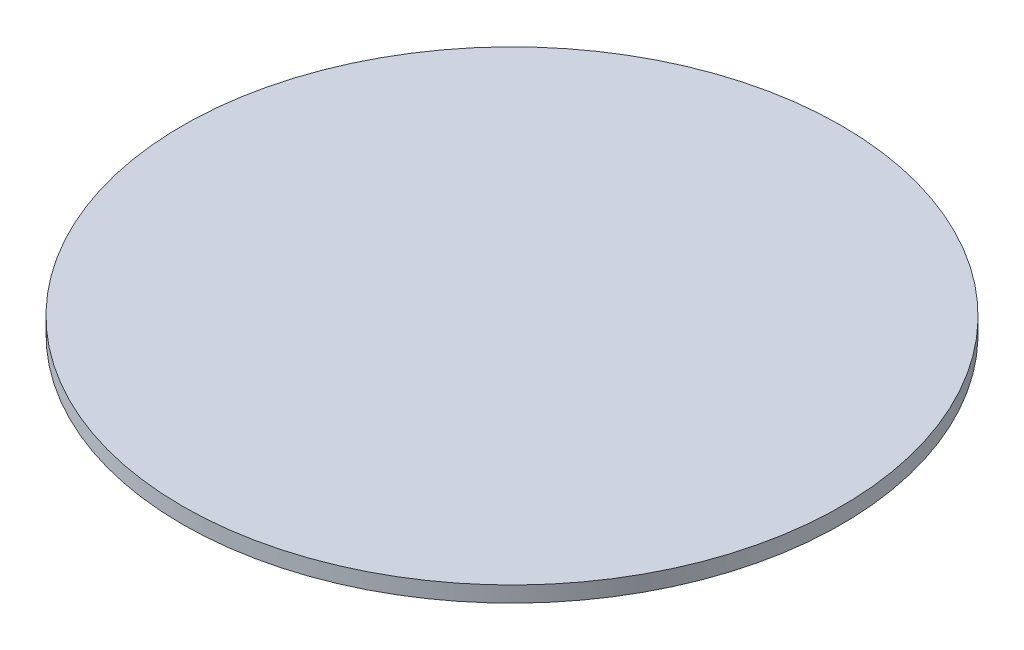
ISO-10303-21;
HEADER;
FILE_DESCRIPTION(('STEP AP214'),'2;1');
FILE_NAME('part.step','',(''),(''),'','','');
FILE_SCHEMA(('AUTOMOTIVE_DESIGN { 1 0 10303 214 1 1 1 1 }'));
ENDSEC;
DATA;
#1=APPLICATION_CONTEXT('core data for automotive mechanical design processes');
#2=APPLICATION_PROTOCOL_DEFINITION('international standard','automotive_design',2000,#1);
#3=PRODUCT_CONTEXT('',#1,'mechanical');
#4=PRODUCT('Part','Part','',(#3));
#5=PRODUCT_RELATED_PRODUCT_CATEGORY('part','',(#4));
#6=PRODUCT_DEFINITION_FORMATION('','',#4);
#7=PRODUCT_DEFINITION_CONTEXT('part definition',#1,'design');
#8=PRODUCT_DEFINITION('design','',#6,#7);
#9=PRODUCT_DEFINITION_SHAPE('','',#8);
#10=(LENGTH_UNIT() NAMED_UNIT(*) SI_UNIT(.MILLI.,.METRE.));
#11=(NAMED_UNIT(*) PLANE_ANGLE_UNIT() SI_UNIT($,.RADIAN.));
#12=(NAMED_UNIT(*) SI_UNIT($,.STERADIAN.) SOLID_ANGLE_UNIT());
#13=UNCERTAINTY_MEASURE_WITH_UNIT(LENGTH_MEASURE(1.E-05),#10,'distance_accuracy_value','');
#14=(GEOMETRIC_REPRESENTATION_CONTEXT(3) GLOBAL_UNCERTAINTY_ASSIGNED_CONTEXT((#13)) GLOBAL_UNIT_ASSIGNED_CONTEXT((#10,
#11,#12)) REPRESENTATION_CONTEXT('',''));
#15=CARTESIAN_POINT('',(0.,0.,0.));
#16=DIRECTION('',(0.,0.,1.));
#17=DIRECTION('',(1.,0.,0.));
#18=AXIS2_PLACEMENT_3D('',#15,#16,#17);
#19=CARTESIAN_POINT('',(-20.95,-0.500000000000001,0.));
#20=DIRECTION('',(0.,1.,0.));
#21=DIRECTION('',(0.,0.,1.));
#22=AXIS2_PLACEMENT_3D('',#19,#20,#21);
#23=PLANE('',#22);
#24=DIRECTION('',(-1.,0.,0.));
#25=VECTOR('',#24,1.);
#26=CARTESIAN_POINT('',(-2.,-0.500000000000001,15.5));
#27=LINE('',#26,#25);
#28=CARTESIAN_POINT('',(2.,-0.500000000000001,15.5));
#29=VERTEX_POINT('',#28);
#30=CARTESIAN_POINT('',(-2.,-0.500000000000001,15.5));
#31=VERTEX_POINT('',#30);
#32=EDGE_CURVE('E120',#29,#31,#27,.T.);
#33=ORIENTED_EDGE('',*,*,#32,.F.);
#34=DIRECTION('',(0.,0.,1.));
#35=VECTOR('',#34,1.);
#36=CARTESIAN_POINT('',(2.,-0.500000000000001,14.5));
#37=LINE('',#36,#35);
#38=CARTESIAN_POINT('',(2.,-0.500000000000001,14.5));
#39=VERTEX_POINT('',#38);
#40=EDGE_CURVE('E133',#39,#29,#37,.T.);
#41=ORIENTED_EDGE('',*,*,#40,.F.);
#42=DIRECTION('',(1.,0.,0.));
#43=VECTOR('',#42,1.);
#44=CARTESIAN_POINT('',(-2.,-0.500000000000001,14.5));
#45=LINE('',#44,#43);
#46=CARTESIAN_POINT('',(-2.,-0.500000000000001,14.5));
#47=VERTEX_POINT('',#46);
#48=EDGE_CURVE('E142',#47,#39,#45,.T.);
#49=ORIENTED_EDGE('',*,*,#48,.F.);
#50=DIRECTION('',(0.,0.,-1.));
#51=VECTOR('',#50,1.);
#52=CARTESIAN_POINT('',(-2.,-0.500000000000001,14.5));
#53=LINE('',#52,#51);
#54=EDGE_CURVE('E123',#31,#47,#53,.T.);
#55=ORIENTED_EDGE('',*,*,#54,.F.);
#56=EDGE_LOOP('',(#33,#41,#49,#55));
#57=FACE_BOUND('',#56,.T.);
#58=CARTESIAN_POINT('',(0.,-0.500000000000002,0.));
#59=DIRECTION('',(0.,-1.,0.));
#60=DIRECTION('',(0.,0.,-1.));
#61=AXIS2_PLACEMENT_3D('',#58,#59,#60);
#62=CIRCLE('',#61,20.95);
#63=CARTESIAN_POINT('',(0.,-0.500000000000002,-20.95));
#64=VERTEX_POINT('',#63);
#65=EDGE_CURVE('E11',#64,#64,#62,.T.);
#66=ORIENTED_EDGE('',*,*,#65,.T.);
#67=EDGE_LOOP('',(#66));
#68=FACE_BOUND('',#67,.T.);
#69=DIRECTION('',(-1.,0.,0.));
#70=VECTOR('',#69,1.);
#71=CARTESIAN_POINT('',(-1.99999999999999,-0.500000000000001,-14.5));
#72=LINE('',#71,#70);
#73=CARTESIAN_POINT('',(2.,-0.500000000000001,-14.5));
#74=VERTEX_POINT('',#73);
#75=CARTESIAN_POINT('',(-2.,-0.500000000000001,-14.5));
#76=VERTEX_POINT('',#75);
#77=EDGE_CURVE('E119',#74,#76,#72,.T.);
#78=ORIENTED_EDGE('',*,*,#77,.F.);
#79=DIRECTION('',(0.,0.,1.));
#80=VECTOR('',#79,1.);
#81=CARTESIAN_POINT('',(2.,-0.500000000000001,-14.5));
#82=LINE('',#81,#80);
#83=CARTESIAN_POINT('',(2.,-0.500000000000001,-15.5));
#84=VERTEX_POINT('',#83);
#85=EDGE_CURVE('E116',#84,#74,#82,.T.);
#86=ORIENTED_EDGE('',*,*,#85,.F.);
#87=DIRECTION('',(1.,0.,0.));
#88=VECTOR('',#87,1.);
#89=CARTESIAN_POINT('',(-2.,-0.500000000000001,-15.5));
#90=LINE('',#89,#88);
#91=CARTESIAN_POINT('',(-2.,-0.500000000000001,-15.5));
#92=VERTEX_POINT('',#91);
#93=EDGE_CURVE('E54',#92,#84,#90,.T.);
#94=ORIENTED_EDGE('',*,*,#93,.F.);
#95=DIRECTION('',(0.,0.,-1.));
#96=VECTOR('',#95,1.);
#97=CARTESIAN_POINT('',(-1.99999999999999,-0.500000000000001,-14.5));
#98=LINE('',#97,#96);
#99=EDGE_CURVE('E49',#76,#92,#98,.T.);
#100=ORIENTED_EDGE('',*,*,#99,.F.);
#101=EDGE_LOOP('',(#78,#86,#94,#100));
#102=FACE_BOUND('',#101,.T.);
#103=ADVANCED_FACE('F35',(#57,#68,#102),#23,.F.);
#104=CARTESIAN_POINT('',(0.,0.,0.));
#105=DIRECTION('',(0.,-1.,0.));
#106=DIRECTION('',(0.,0.,-1.));
#107=AXIS2_PLACEMENT_3D('',#104,#105,#106);
#108=CYLINDRICAL_SURFACE('',#107,20.95);
#109=ORIENTED_EDGE('',*,*,#65,.F.);
#110=EDGE_LOOP('',(#109));
#111=FACE_BOUND('',#110,.T.);
#112=CARTESIAN_POINT('',(0.,0.499999999999999,0.));
#113=DIRECTION('',(0.,-1.,0.));
#114=DIRECTION('',(0.,0.,-1.));
#115=AXIS2_PLACEMENT_3D('',#112,#113,#114);
#116=CIRCLE('',#115,20.95);
#117=CARTESIAN_POINT('',(0.,0.499999999999999,-20.95));
#118=VERTEX_POINT('',#117);
#119=EDGE_CURVE('E42',#118,#118,#116,.T.);
#120=ORIENTED_EDGE('',*,*,#119,.T.);
#121=EDGE_LOOP('',(#120));
#122=FACE_BOUND('',#121,.T.);
#123=ADVANCED_FACE('F160',(#111,#122),#108,.T.);
#124=CARTESIAN_POINT('',(-20.95,0.499999999999999,0.));
#125=DIRECTION('',(0.,-1.,0.));
#126=DIRECTION('',(0.,0.,-1.));
#127=AXIS2_PLACEMENT_3D('',#124,#125,#126);
#128=PLANE('',#127);
#129=ORIENTED_EDGE('',*,*,#119,.F.);
#130=EDGE_LOOP('',(#129));
#131=FACE_BOUND('',#130,.T.);
#132=ADVANCED_FACE('F162',(#131),#128,.F.);
#133=CARTESIAN_POINT('',(-2.,-2.3,15.5));
#134=DIRECTION('',(0.,0.,-1.));
#135=DIRECTION('',(-1.,0.,0.));
#136=AXIS2_PLACEMENT_3D('',#133,#134,#135);
#137=PLANE('',#136);
#138=ORIENTED_EDGE('',*,*,#32,.T.);
#139=DIRECTION('',(0.,1.,0.));
#140=VECTOR('',#139,1.);
#141=CARTESIAN_POINT('',(-2.,-2.3,15.5));
#142=LINE('',#141,#140);
#143=CARTESIAN_POINT('',(-2.,-2.3,15.5));
#144=VERTEX_POINT('',#143);
#145=EDGE_CURVE('E155',#144,#31,#142,.T.);
#146=ORIENTED_EDGE('',*,*,#145,.F.);
#147=DIRECTION('',(-1.,0.,0.));
#148=VECTOR('',#147,1.);
#149=CARTESIAN_POINT('',(-2.,-2.3,15.5));
#150=LINE('',#149,#148);
#151=CARTESIAN_POINT('',(2.,-2.3,15.5));
#152=VERTEX_POINT('',#151);
#153=EDGE_CURVE('E129',#152,#144,#150,.T.);
#154=ORIENTED_EDGE('',*,*,#153,.F.);
#155=DIRECTION('',(0.,1.,0.));
#156=VECTOR('',#155,1.);
#157=CARTESIAN_POINT('',(2.,-2.3,15.5));
#158=LINE('',#157,#156);
#159=EDGE_CURVE('E138',#152,#29,#158,.T.);
#160=ORIENTED_EDGE('',*,*,#159,.T.);
#161=EDGE_LOOP('',(#138,#146,#154,#160));
#162=FACE_BOUND('',#161,.T.);
#163=ADVANCED_FACE('F164',(#162),#137,.F.);
#164=CARTESIAN_POINT('',(-2.,-2.3,14.5));
#165=DIRECTION('',(1.,0.,0.));
#166=DIRECTION('',(0.,0.,-1.));
#167=AXIS2_PLACEMENT_3D('',#164,#165,#166);
#168=PLANE('',#167);
#169=ORIENTED_EDGE('',*,*,#54,.T.);
#170=DIRECTION('',(0.,1.,0.));
#171=VECTOR('',#170,1.);
#172=CARTESIAN_POINT('',(-2.,-2.3,14.5));
#173=LINE('',#172,#171);
#174=CARTESIAN_POINT('',(-2.,-2.3,14.5));
#175=VERTEX_POINT('',#174);
#176=EDGE_CURVE('E152',#175,#47,#173,.T.);
#177=ORIENTED_EDGE('',*,*,#176,.F.);
#178=DIRECTION('',(0.,0.,-1.));
#179=VECTOR('',#178,1.);
#180=CARTESIAN_POINT('',(-2.,-2.3,14.5));
#181=LINE('',#180,#179);
#182=EDGE_CURVE('E132',#144,#175,#181,.T.);
#183=ORIENTED_EDGE('',*,*,#182,.F.);
#184=ORIENTED_EDGE('',*,*,#145,.T.);
#185=EDGE_LOOP('',(#169,#177,#183,#184));
#186=FACE_BOUND('',#185,.T.);
#187=ADVANCED_FACE('F170',(#186),#168,.F.);
#188=CARTESIAN_POINT('',(-2.,-2.3,14.5));
#189=DIRECTION('',(0.,0.,1.));
#190=DIRECTION('',(1.,0.,0.));
#191=AXIS2_PLACEMENT_3D('',#188,#189,#190);
#192=PLANE('',#191);
#193=ORIENTED_EDGE('',*,*,#48,.T.);
#194=DIRECTION('',(0.,1.,0.));
#195=VECTOR('',#194,1.);
#196=CARTESIAN_POINT('',(2.,-2.3,14.5));
#197=LINE('',#196,#195);
#198=CARTESIAN_POINT('',(2.,-2.3,14.5));
#199=VERTEX_POINT('',#198);
#200=EDGE_CURVE('E149',#199,#39,#197,.T.);
#201=ORIENTED_EDGE('',*,*,#200,.F.);
#202=DIRECTION('',(1.,0.,0.));
#203=VECTOR('',#202,1.);
#204=CARTESIAN_POINT('',(-2.,-2.3,14.5));
#205=LINE('',#204,#203);
#206=EDGE_CURVE('E135',#175,#199,#205,.T.);
#207=ORIENTED_EDGE('',*,*,#206,.F.);
#208=ORIENTED_EDGE('',*,*,#176,.T.);
#209=EDGE_LOOP('',(#193,#201,#207,#208));
#210=FACE_BOUND('',#209,.T.);
#211=ADVANCED_FACE('F214',(#210),#192,.F.);
#212=CARTESIAN_POINT('',(2.,-2.3,14.5));
#213=DIRECTION('',(-1.,0.,0.));
#214=DIRECTION('',(0.,0.,1.));
#215=AXIS2_PLACEMENT_3D('',#212,#213,#214);
#216=PLANE('',#215);
#217=ORIENTED_EDGE('',*,*,#40,.T.);
#218=ORIENTED_EDGE('',*,*,#159,.F.);
#219=DIRECTION('',(0.,0.,1.));
#220=VECTOR('',#219,1.);
#221=CARTESIAN_POINT('',(2.,-2.3,14.5));
#222=LINE('',#221,#220);
#223=EDGE_CURVE('E137',#199,#152,#222,.T.);
#224=ORIENTED_EDGE('',*,*,#223,.F.);
#225=ORIENTED_EDGE('',*,*,#200,.T.);
#226=EDGE_LOOP('',(#217,#218,#224,#225));
#227=FACE_BOUND('',#226,.T.);
#228=ADVANCED_FACE('F210',(#227),#216,.F.);
#229=CARTESIAN_POINT('',(0.,-2.3,0.));
#230=DIRECTION('',(0.,-1.,0.));
#231=DIRECTION('',(0.,0.,-1.));
#232=AXIS2_PLACEMENT_3D('',#229,#230,#231);
#233=PLANE('',#232);
#234=ORIENTED_EDGE('',*,*,#153,.T.);
#235=ORIENTED_EDGE('',*,*,#182,.T.);
#236=ORIENTED_EDGE('',*,*,#206,.T.);
#237=ORIENTED_EDGE('',*,*,#223,.T.);
#238=EDGE_LOOP('',(#234,#235,#236,#237));
#239=FACE_BOUND('',#238,.T.);
#240=ADVANCED_FACE('F207',(#239),#233,.T.);
#241=CARTESIAN_POINT('',(-1.99999999999999,-2.3,-14.5));
#242=DIRECTION('',(0.,0.,-1.));
#243=DIRECTION('',(-1.,0.,0.));
#244=AXIS2_PLACEMENT_3D('',#241,#242,#243);
#245=PLANE('',#244);
#246=ORIENTED_EDGE('',*,*,#77,.T.);
#247=DIRECTION('',(0.,1.,0.));
#248=VECTOR('',#247,1.);
#249=CARTESIAN_POINT('',(-1.99999999999999,-2.3,-14.5));
#250=LINE('',#249,#248);
#251=CARTESIAN_POINT('',(-1.99999999999999,-2.3,-14.5));
#252=VERTEX_POINT('',#251);
#253=EDGE_CURVE('E100',#252,#76,#250,.T.);
#254=ORIENTED_EDGE('',*,*,#253,.F.);
#255=DIRECTION('',(-1.,0.,0.));
#256=VECTOR('',#255,1.);
#257=CARTESIAN_POINT('',(-1.99999999999999,-2.3,-14.5));
#258=LINE('',#257,#256);
#259=CARTESIAN_POINT('',(2.,-2.3,-14.5));
#260=VERTEX_POINT('',#259);
#261=EDGE_CURVE('E107',#260,#252,#258,.T.);
#262=ORIENTED_EDGE('',*,*,#261,.F.);
#263=DIRECTION('',(0.,1.,0.));
#264=VECTOR('',#263,1.);
#265=CARTESIAN_POINT('',(2.,-2.3,-14.5));
#266=LINE('',#265,#264);
#267=EDGE_CURVE('E185',#260,#74,#266,.T.);
#268=ORIENTED_EDGE('',*,*,#267,.T.);
#269=EDGE_LOOP('',(#246,#254,#262,#268));
#270=FACE_BOUND('',#269,.T.);
#271=ADVANCED_FACE('F118',(#270),#245,.F.);
#272=CARTESIAN_POINT('',(-1.99999999999999,-2.3,-14.5));
#273=DIRECTION('',(1.,0.,0.));
#274=DIRECTION('',(0.,0.,-1.));
#275=AXIS2_PLACEMENT_3D('',#272,#273,#274);
#276=PLANE('',#275);
#277=ORIENTED_EDGE('',*,*,#99,.T.);
#278=DIRECTION('',(0.,1.,0.));
#279=VECTOR('',#278,1.);
#280=CARTESIAN_POINT('',(-2.,-2.3,-15.5));
#281=LINE('',#280,#279);
#282=CARTESIAN_POINT('',(-2.,-2.3,-15.5));
#283=VERTEX_POINT('',#282);
#284=EDGE_CURVE('E103',#283,#92,#281,.T.);
#285=ORIENTED_EDGE('',*,*,#284,.F.);
#286=DIRECTION('',(0.,0.,-1.));
#287=VECTOR('',#286,1.);
#288=CARTESIAN_POINT('',(-1.99999999999999,-2.3,-14.5));
#289=LINE('',#288,#287);
#290=EDGE_CURVE('E96',#252,#283,#289,.T.);
#291=ORIENTED_EDGE('',*,*,#290,.F.);
#292=ORIENTED_EDGE('',*,*,#253,.T.);
#293=EDGE_LOOP('',(#277,#285,#291,#292));
#294=FACE_BOUND('',#293,.T.);
#295=ADVANCED_FACE('F98',(#294),#276,.F.);
#296=CARTESIAN_POINT('',(-2.,-2.3,-15.5));
#297=DIRECTION('',(0.,0.,1.));
#298=DIRECTION('',(1.,0.,0.));
#299=AXIS2_PLACEMENT_3D('',#296,#297,#298);
#300=PLANE('',#299);
#301=ORIENTED_EDGE('',*,*,#93,.T.);
#302=DIRECTION('',(0.,1.,0.));
#303=VECTOR('',#302,1.);
#304=CARTESIAN_POINT('',(2.,-2.3,-15.5));
#305=LINE('',#304,#303);
#306=CARTESIAN_POINT('',(2.,-2.3,-15.5));
#307=VERTEX_POINT('',#306);
#308=EDGE_CURVE('E125',#307,#84,#305,.T.);
#309=ORIENTED_EDGE('',*,*,#308,.F.);
#310=DIRECTION('',(1.,0.,0.));
#311=VECTOR('',#310,1.);
#312=CARTESIAN_POINT('',(-2.,-2.3,-15.5));
#313=LINE('',#312,#311);
#314=EDGE_CURVE('E106',#283,#307,#313,.T.);
#315=ORIENTED_EDGE('',*,*,#314,.F.);
#316=ORIENTED_EDGE('',*,*,#284,.T.);
#317=EDGE_LOOP('',(#301,#309,#315,#316));
#318=FACE_BOUND('',#317,.T.);
#319=ADVANCED_FACE('F194',(#318),#300,.F.);
#320=CARTESIAN_POINT('',(2.,-2.3,-14.5));
#321=DIRECTION('',(-1.,0.,0.));
#322=DIRECTION('',(0.,0.,1.));
#323=AXIS2_PLACEMENT_3D('',#320,#321,#322);
#324=PLANE('',#323);
#325=ORIENTED_EDGE('',*,*,#85,.T.);
#326=ORIENTED_EDGE('',*,*,#267,.F.);
#327=DIRECTION('',(0.,0.,1.));
#328=VECTOR('',#327,1.);
#329=CARTESIAN_POINT('',(2.,-2.3,-14.5));
#330=LINE('',#329,#328);
#331=EDGE_CURVE('E112',#307,#260,#330,.T.);
#332=ORIENTED_EDGE('',*,*,#331,.F.);
#333=ORIENTED_EDGE('',*,*,#308,.T.);
#334=EDGE_LOOP('',(#325,#326,#332,#333));
#335=FACE_BOUND('',#334,.T.);
#336=ADVANCED_FACE('F184',(#335),#324,.F.);
#337=CARTESIAN_POINT('',(0.,-2.3,0.));
#338=DIRECTION('',(0.,1.,0.));
#339=DIRECTION('',(0.,0.,1.));
#340=AXIS2_PLACEMENT_3D('',#337,#338,#339);
#341=PLANE('',#340);
#342=ORIENTED_EDGE('',*,*,#261,.T.);
#343=ORIENTED_EDGE('',*,*,#290,.T.);
#344=ORIENTED_EDGE('',*,*,#314,.T.);
#345=ORIENTED_EDGE('',*,*,#331,.T.);
#346=EDGE_LOOP('',(#342,#343,#344,#345));
#347=FACE_BOUND('',#346,.T.);
#348=ADVANCED_FACE('F110',(#347),#341,.F.);
#349=CLOSED_SHELL('',(#103,#123,#132,#163,#187,#211,#228,#240,#271,#295,#319,#336,#348));
#350=MANIFOLD_SOLID_BREP('B2',#349);
#351=ADVANCED_BREP_SHAPE_REPRESENTATION('',(#18,#350),#14);
#352=SHAPE_DEFINITION_REPRESENTATION(#9,#351);
ENDSEC;
END-ISO-10303-21;
